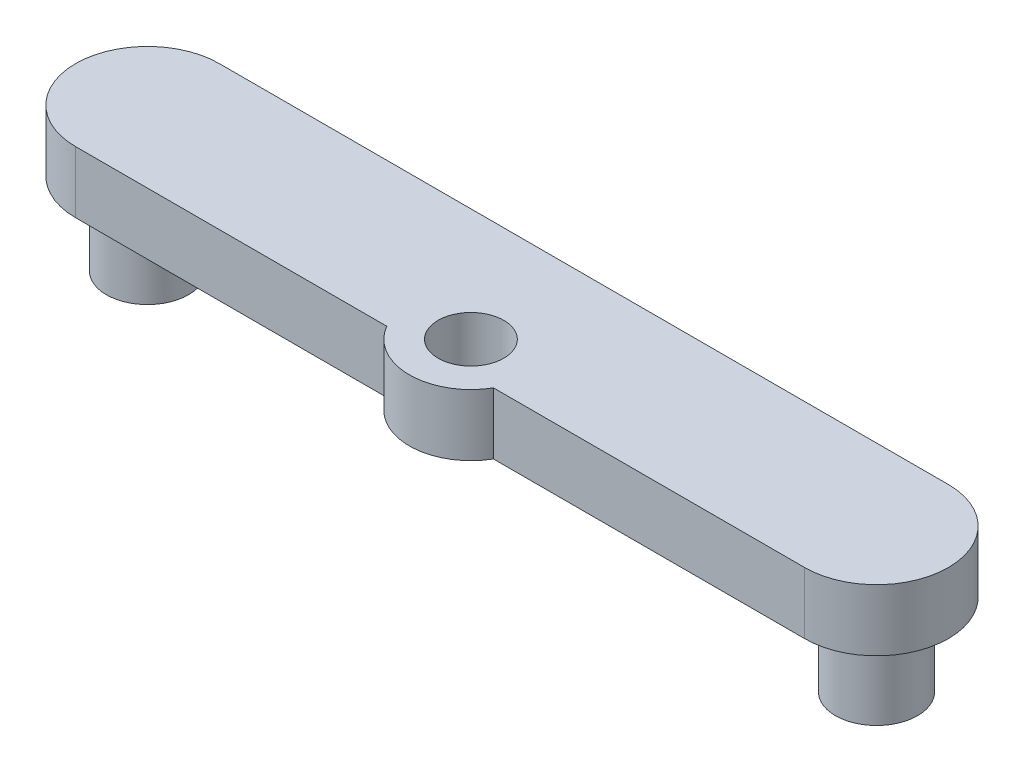
ISO-10303-21;
HEADER;
FILE_DESCRIPTION(('STEP AP214'),'2;1');
FILE_NAME('part.step','',(''),(''),'','','');
FILE_SCHEMA(('AUTOMOTIVE_DESIGN { 1 0 10303 214 1 1 1 1 }'));
ENDSEC;
DATA;
#1=APPLICATION_CONTEXT('core data for automotive mechanical design processes');
#2=APPLICATION_PROTOCOL_DEFINITION('international standard','automotive_design',2000,#1);
#3=PRODUCT_CONTEXT('',#1,'mechanical');
#4=PRODUCT('Part','Part','',(#3));
#5=PRODUCT_RELATED_PRODUCT_CATEGORY('part','',(#4));
#6=PRODUCT_DEFINITION_FORMATION('','',#4);
#7=PRODUCT_DEFINITION_CONTEXT('part definition',#1,'design');
#8=PRODUCT_DEFINITION('design','',#6,#7);
#9=PRODUCT_DEFINITION_SHAPE('','',#8);
#10=(LENGTH_UNIT() NAMED_UNIT(*) SI_UNIT(.MILLI.,.METRE.));
#11=(NAMED_UNIT(*) PLANE_ANGLE_UNIT() SI_UNIT($,.RADIAN.));
#12=(NAMED_UNIT(*) SI_UNIT($,.STERADIAN.) SOLID_ANGLE_UNIT());
#13=UNCERTAINTY_MEASURE_WITH_UNIT(LENGTH_MEASURE(1.E-05),#10,'distance_accuracy_value','');
#14=(GEOMETRIC_REPRESENTATION_CONTEXT(3) GLOBAL_UNCERTAINTY_ASSIGNED_CONTEXT((#13)) GLOBAL_UNIT_ASSIGNED_CONTEXT((#10,
#11,#12)) REPRESENTATION_CONTEXT('',''));
#15=CARTESIAN_POINT('',(0.,0.,0.));
#16=DIRECTION('',(0.,0.,1.));
#17=DIRECTION('',(1.,0.,0.));
#18=AXIS2_PLACEMENT_3D('',#15,#16,#17);
#19=CARTESIAN_POINT('',(0.,3.,3.5));
#20=DIRECTION('',(0.,0.,1.));
#21=DIRECTION('',(1.,0.,0.));
#22=AXIS2_PLACEMENT_3D('',#19,#20,#21);
#23=PLANE('',#22);
#24=DIRECTION('',(-1.,0.,0.));
#25=VECTOR('',#24,1.);
#26=CARTESIAN_POINT('',(0.,0.,3.5));
#27=LINE('',#26,#25);
#28=CARTESIAN_POINT('',(-2.59807621135332,0.,3.5));
#29=VERTEX_POINT('',#28);
#30=CARTESIAN_POINT('',(-17.75,0.,3.5));
#31=VERTEX_POINT('',#30);
#32=EDGE_CURVE('E124',#29,#31,#27,.T.);
#33=ORIENTED_EDGE('',*,*,#32,.F.);
#34=DIRECTION('',(0.,-1.,0.));
#35=VECTOR('',#34,1.);
#36=CARTESIAN_POINT('',(-2.59807621135332,3.,3.5));
#37=LINE('',#36,#35);
#38=CARTESIAN_POINT('',(-2.59807621135332,3.,3.5));
#39=VERTEX_POINT('',#38);
#40=EDGE_CURVE('E89',#39,#29,#37,.T.);
#41=ORIENTED_EDGE('',*,*,#40,.F.);
#42=DIRECTION('',(-1.,0.,0.));
#43=VECTOR('',#42,1.);
#44=CARTESIAN_POINT('',(0.,3.,3.5));
#45=LINE('',#44,#43);
#46=CARTESIAN_POINT('',(-17.75,3.,3.5));
#47=VERTEX_POINT('',#46);
#48=EDGE_CURVE('E139',#39,#47,#45,.T.);
#49=ORIENTED_EDGE('',*,*,#48,.T.);
#50=DIRECTION('',(0.,-1.,0.));
#51=VECTOR('',#50,1.);
#52=CARTESIAN_POINT('',(-17.75,3.,3.5));
#53=LINE('',#52,#51);
#54=EDGE_CURVE('E84',#47,#31,#53,.T.);
#55=ORIENTED_EDGE('',*,*,#54,.T.);
#56=EDGE_LOOP('',(#33,#41,#49,#55));
#57=FACE_BOUND('',#56,.T.);
#58=ADVANCED_FACE('F37',(#57),#23,.T.);
#59=CARTESIAN_POINT('',(0.,3.,2.));
#60=DIRECTION('',(0.,-1.,0.));
#61=DIRECTION('',(0.,0.,-1.));
#62=AXIS2_PLACEMENT_3D('',#59,#60,#61);
#63=CYLINDRICAL_SURFACE('',#62,3.);
#64=CARTESIAN_POINT('',(0.,0.,2.));
#65=DIRECTION('',(0.,1.,0.));
#66=DIRECTION('',(0.,0.,1.));
#67=AXIS2_PLACEMENT_3D('',#64,#65,#66);
#68=CIRCLE('',#67,3.);
#69=CARTESIAN_POINT('',(2.59807621135332,0.,3.5));
#70=VERTEX_POINT('',#69);
#71=EDGE_CURVE('E127',#29,#70,#68,.T.);
#72=ORIENTED_EDGE('',*,*,#71,.T.);
#73=DIRECTION('',(0.,-1.,0.));
#74=VECTOR('',#73,1.);
#75=CARTESIAN_POINT('',(2.59807621135332,3.,3.5));
#76=LINE('',#75,#74);
#77=CARTESIAN_POINT('',(2.59807621135332,3.,3.5));
#78=VERTEX_POINT('',#77);
#79=EDGE_CURVE('E143',#78,#70,#76,.T.);
#80=ORIENTED_EDGE('',*,*,#79,.F.);
#81=CARTESIAN_POINT('',(0.,3.,2.));
#82=DIRECTION('',(0.,1.,0.));
#83=DIRECTION('',(0.,0.,1.));
#84=AXIS2_PLACEMENT_3D('',#81,#82,#83);
#85=CIRCLE('',#84,3.);
#86=EDGE_CURVE('E187',#39,#78,#85,.T.);
#87=ORIENTED_EDGE('',*,*,#86,.F.);
#88=ORIENTED_EDGE('',*,*,#40,.T.);
#89=EDGE_LOOP('',(#72,#80,#87,#88));
#90=FACE_BOUND('',#89,.T.);
#91=ADVANCED_FACE('F39',(#90),#63,.T.);
#92=CARTESIAN_POINT('',(17.75,0.,3.49999999999999));
#93=VERTEX_POINT('',#92);
#94=EDGE_CURVE('E129',#93,#70,#27,.T.);
#95=ORIENTED_EDGE('',*,*,#94,.F.);
#96=DIRECTION('',(0.,-1.,0.));
#97=VECTOR('',#96,1.);
#98=CARTESIAN_POINT('',(17.75,3.,3.49999999999999));
#99=LINE('',#98,#97);
#100=CARTESIAN_POINT('',(17.75,3.,3.49999999999999));
#101=VERTEX_POINT('',#100);
#102=EDGE_CURVE('E113',#101,#93,#99,.T.);
#103=ORIENTED_EDGE('',*,*,#102,.F.);
#104=EDGE_CURVE('E106',#101,#78,#45,.T.);
#105=ORIENTED_EDGE('',*,*,#104,.T.);
#106=ORIENTED_EDGE('',*,*,#79,.T.);
#107=EDGE_LOOP('',(#95,#103,#105,#106));
#108=FACE_BOUND('',#107,.T.);
#109=ADVANCED_FACE('F173',(#108),#23,.T.);
#110=CARTESIAN_POINT('',(17.75,3.,0.));
#111=DIRECTION('',(0.,-1.,0.));
#112=DIRECTION('',(0.,0.,-1.));
#113=AXIS2_PLACEMENT_3D('',#110,#111,#112);
#114=CYLINDRICAL_SURFACE('',#113,3.5);
#115=CARTESIAN_POINT('',(17.75,0.,0.));
#116=DIRECTION('',(0.,1.,0.));
#117=DIRECTION('',(0.,0.,1.));
#118=AXIS2_PLACEMENT_3D('',#115,#116,#117);
#119=CIRCLE('',#118,3.5);
#120=CARTESIAN_POINT('',(17.75,0.,-3.5));
#121=VERTEX_POINT('',#120);
#122=EDGE_CURVE('E112',#93,#121,#119,.T.);
#123=ORIENTED_EDGE('',*,*,#122,.T.);
#124=DIRECTION('',(0.,-1.,0.));
#125=VECTOR('',#124,1.);
#126=CARTESIAN_POINT('',(17.75,3.,-3.5));
#127=LINE('',#126,#125);
#128=CARTESIAN_POINT('',(17.75,3.,-3.5));
#129=VERTEX_POINT('',#128);
#130=EDGE_CURVE('E109',#129,#121,#127,.T.);
#131=ORIENTED_EDGE('',*,*,#130,.F.);
#132=CARTESIAN_POINT('',(17.75,3.,0.));
#133=DIRECTION('',(0.,1.,0.));
#134=DIRECTION('',(0.,0.,1.));
#135=AXIS2_PLACEMENT_3D('',#132,#133,#134);
#136=CIRCLE('',#135,3.5);
#137=EDGE_CURVE('E99',#101,#129,#136,.T.);
#138=ORIENTED_EDGE('',*,*,#137,.F.);
#139=ORIENTED_EDGE('',*,*,#102,.T.);
#140=EDGE_LOOP('',(#123,#131,#138,#139));
#141=FACE_BOUND('',#140,.T.);
#142=ADVANCED_FACE('F110',(#141),#114,.T.);
#143=CARTESIAN_POINT('',(0.,3.,-3.5));
#144=DIRECTION('',(0.,0.,1.));
#145=DIRECTION('',(1.,0.,0.));
#146=AXIS2_PLACEMENT_3D('',#143,#144,#145);
#147=PLANE('',#146);
#148=DIRECTION('',(-1.,0.,0.));
#149=VECTOR('',#148,1.);
#150=CARTESIAN_POINT('',(0.,0.,-3.5));
#151=LINE('',#150,#149);
#152=CARTESIAN_POINT('',(-17.75,0.,-3.49999999999999));
#153=VERTEX_POINT('',#152);
#154=EDGE_CURVE('E77',#121,#153,#151,.T.);
#155=ORIENTED_EDGE('',*,*,#154,.T.);
#156=DIRECTION('',(0.,-1.,0.));
#157=VECTOR('',#156,1.);
#158=CARTESIAN_POINT('',(-17.75,3.,-3.49999999999999));
#159=LINE('',#158,#157);
#160=CARTESIAN_POINT('',(-17.75,3.,-3.49999999999999));
#161=VERTEX_POINT('',#160);
#162=EDGE_CURVE('E114',#161,#153,#159,.T.);
#163=ORIENTED_EDGE('',*,*,#162,.F.);
#164=DIRECTION('',(-1.,0.,0.));
#165=VECTOR('',#164,1.);
#166=CARTESIAN_POINT('',(0.,3.,-3.5));
#167=LINE('',#166,#165);
#168=EDGE_CURVE('E104',#129,#161,#167,.T.);
#169=ORIENTED_EDGE('',*,*,#168,.F.);
#170=ORIENTED_EDGE('',*,*,#130,.T.);
#171=EDGE_LOOP('',(#155,#163,#169,#170));
#172=FACE_BOUND('',#171,.T.);
#173=ADVANCED_FACE('F116',(#172),#147,.F.);
#174=CARTESIAN_POINT('',(-17.75,3.,0.));
#175=DIRECTION('',(0.,-1.,0.));
#176=DIRECTION('',(0.,0.,-1.));
#177=AXIS2_PLACEMENT_3D('',#174,#175,#176);
#178=CYLINDRICAL_SURFACE('',#177,3.5);
#179=CARTESIAN_POINT('',(-17.75,0.,0.));
#180=DIRECTION('',(0.,1.,0.));
#181=DIRECTION('',(0.,0.,1.));
#182=AXIS2_PLACEMENT_3D('',#179,#180,#181);
#183=CIRCLE('',#182,3.5);
#184=EDGE_CURVE('E134',#153,#31,#183,.T.);
#185=ORIENTED_EDGE('',*,*,#184,.T.);
#186=ORIENTED_EDGE('',*,*,#54,.F.);
#187=CARTESIAN_POINT('',(-17.75,3.,0.));
#188=DIRECTION('',(0.,1.,0.));
#189=DIRECTION('',(0.,0.,1.));
#190=AXIS2_PLACEMENT_3D('',#187,#188,#189);
#191=CIRCLE('',#190,3.5);
#192=EDGE_CURVE('E54',#161,#47,#191,.T.);
#193=ORIENTED_EDGE('',*,*,#192,.F.);
#194=ORIENTED_EDGE('',*,*,#162,.T.);
#195=EDGE_LOOP('',(#185,#186,#193,#194));
#196=FACE_BOUND('',#195,.T.);
#197=ADVANCED_FACE('F162',(#196),#178,.T.);
#198=CARTESIAN_POINT('',(0.,3.,2.));
#199=DIRECTION('',(0.,-1.,0.));
#200=DIRECTION('',(0.,0.,-1.));
#201=AXIS2_PLACEMENT_3D('',#198,#199,#200);
#202=CYLINDRICAL_SURFACE('',#201,1.6);
#203=CARTESIAN_POINT('',(0.,3.,2.));
#204=DIRECTION('',(0.,1.,0.));
#205=DIRECTION('',(0.,0.,1.));
#206=AXIS2_PLACEMENT_3D('',#203,#204,#205);
#207=CIRCLE('',#206,1.6);
#208=CARTESIAN_POINT('',(0.,3.,3.6));
#209=VERTEX_POINT('',#208);
#210=EDGE_CURVE('E118',#209,#209,#207,.T.);
#211=ORIENTED_EDGE('',*,*,#210,.T.);
#212=EDGE_LOOP('',(#211));
#213=FACE_BOUND('',#212,.T.);
#214=CARTESIAN_POINT('',(0.,0.,2.));
#215=DIRECTION('',(0.,1.,0.));
#216=DIRECTION('',(0.,0.,1.));
#217=AXIS2_PLACEMENT_3D('',#214,#215,#216);
#218=CIRCLE('',#217,1.6);
#219=CARTESIAN_POINT('',(0.,0.,3.6));
#220=VERTEX_POINT('',#219);
#221=EDGE_CURVE('E136',#220,#220,#218,.T.);
#222=ORIENTED_EDGE('',*,*,#221,.F.);
#223=EDGE_LOOP('',(#222));
#224=FACE_BOUND('',#223,.T.);
#225=ADVANCED_FACE('F160',(#213,#224),#202,.F.);
#226=CARTESIAN_POINT('',(0.,3.,0.));
#227=DIRECTION('',(0.,1.,0.));
#228=DIRECTION('',(0.,0.,1.));
#229=AXIS2_PLACEMENT_3D('',#226,#227,#228);
#230=PLANE('',#229);
#231=ORIENTED_EDGE('',*,*,#48,.F.);
#232=ORIENTED_EDGE('',*,*,#86,.T.);
#233=ORIENTED_EDGE('',*,*,#104,.F.);
#234=ORIENTED_EDGE('',*,*,#137,.T.);
#235=ORIENTED_EDGE('',*,*,#168,.T.);
#236=ORIENTED_EDGE('',*,*,#192,.T.);
#237=EDGE_LOOP('',(#231,#232,#233,#234,#235,#236));
#238=FACE_BOUND('',#237,.T.);
#239=ORIENTED_EDGE('',*,*,#210,.F.);
#240=EDGE_LOOP('',(#239));
#241=FACE_BOUND('',#240,.T.);
#242=ADVANCED_FACE('F101',(#238,#241),#230,.T.);
#243=CARTESIAN_POINT('',(0.,0.,0.));
#244=DIRECTION('',(0.,1.,0.));
#245=DIRECTION('',(0.,0.,1.));
#246=AXIS2_PLACEMENT_3D('',#243,#244,#245);
#247=PLANE('',#246);
#248=CARTESIAN_POINT('',(17.75,0.,0.));
#249=DIRECTION('',(0.,1.,0.));
#250=DIRECTION('',(0.,0.,1.));
#251=AXIS2_PLACEMENT_3D('',#248,#249,#250);
#252=CIRCLE('',#251,2.);
#253=CARTESIAN_POINT('',(17.75,0.,2.));
#254=VERTEX_POINT('',#253);
#255=EDGE_CURVE('E11',#254,#254,#252,.F.);
#256=ORIENTED_EDGE('',*,*,#255,.F.);
#257=EDGE_LOOP('',(#256));
#258=FACE_BOUND('',#257,.T.);
#259=CARTESIAN_POINT('',(-17.75,0.,0.));
#260=DIRECTION('',(0.,1.,0.));
#261=DIRECTION('',(0.,0.,1.));
#262=AXIS2_PLACEMENT_3D('',#259,#260,#261);
#263=CIRCLE('',#262,2.);
#264=CARTESIAN_POINT('',(-17.75,0.,2.));
#265=VERTEX_POINT('',#264);
#266=EDGE_CURVE('E46',#265,#265,#263,.F.);
#267=ORIENTED_EDGE('',*,*,#266,.F.);
#268=EDGE_LOOP('',(#267));
#269=FACE_BOUND('',#268,.T.);
#270=ORIENTED_EDGE('',*,*,#32,.T.);
#271=ORIENTED_EDGE('',*,*,#184,.F.);
#272=ORIENTED_EDGE('',*,*,#154,.F.);
#273=ORIENTED_EDGE('',*,*,#122,.F.);
#274=ORIENTED_EDGE('',*,*,#94,.T.);
#275=ORIENTED_EDGE('',*,*,#71,.F.);
#276=EDGE_LOOP('',(#270,#271,#272,#273,#274,#275));
#277=FACE_BOUND('',#276,.T.);
#278=ORIENTED_EDGE('',*,*,#221,.T.);
#279=EDGE_LOOP('',(#278));
#280=FACE_BOUND('',#279,.T.);
#281=ADVANCED_FACE('F150',(#258,#269,#277,#280),#247,.F.);
#282=CARTESIAN_POINT('',(-17.75,-4.,0.));
#283=DIRECTION('',(0.,1.,0.));
#284=DIRECTION('',(0.,0.,1.));
#285=AXIS2_PLACEMENT_3D('',#282,#283,#284);
#286=CYLINDRICAL_SURFACE('',#285,2.);
#287=CARTESIAN_POINT('',(-17.75,-4.,0.));
#288=DIRECTION('',(0.,-1.,0.));
#289=DIRECTION('',(0.,0.,-1.));
#290=AXIS2_PLACEMENT_3D('',#287,#288,#289);
#291=CIRCLE('',#290,2.);
#292=CARTESIAN_POINT('',(-17.75,-4.,-2.));
#293=VERTEX_POINT('',#292);
#294=EDGE_CURVE('E128',#293,#293,#291,.T.);
#295=ORIENTED_EDGE('',*,*,#294,.F.);
#296=EDGE_LOOP('',(#295));
#297=FACE_BOUND('',#296,.T.);
#298=ORIENTED_EDGE('',*,*,#266,.T.);
#299=EDGE_LOOP('',(#298));
#300=FACE_BOUND('',#299,.T.);
#301=ADVANCED_FACE('F148',(#297,#300),#286,.T.);
#302=CARTESIAN_POINT('',(-17.75,-4.,0.));
#303=DIRECTION('',(0.,-1.,0.));
#304=DIRECTION('',(0.,0.,-1.));
#305=AXIS2_PLACEMENT_3D('',#302,#303,#304);
#306=PLANE('',#305);
#307=ORIENTED_EDGE('',*,*,#294,.T.);
#308=EDGE_LOOP('',(#307));
#309=FACE_BOUND('',#308,.T.);
#310=ADVANCED_FACE('F201',(#309),#306,.T.);
#311=CARTESIAN_POINT('',(17.75,-4.,0.));
#312=DIRECTION('',(0.,1.,0.));
#313=DIRECTION('',(0.,0.,1.));
#314=AXIS2_PLACEMENT_3D('',#311,#312,#313);
#315=CYLINDRICAL_SURFACE('',#314,2.);
#316=CARTESIAN_POINT('',(17.75,-4.,0.));
#317=DIRECTION('',(0.,-1.,0.));
#318=DIRECTION('',(0.,0.,-1.));
#319=AXIS2_PLACEMENT_3D('',#316,#317,#318);
#320=CIRCLE('',#319,2.);
#321=CARTESIAN_POINT('',(17.75,-4.,-2.));
#322=VERTEX_POINT('',#321);
#323=EDGE_CURVE('E192',#322,#322,#320,.T.);
#324=ORIENTED_EDGE('',*,*,#323,.F.);
#325=EDGE_LOOP('',(#324));
#326=FACE_BOUND('',#325,.T.);
#327=ORIENTED_EDGE('',*,*,#255,.T.);
#328=EDGE_LOOP('',(#327));
#329=FACE_BOUND('',#328,.T.);
#330=ADVANCED_FACE('F198',(#326,#329),#315,.T.);
#331=CARTESIAN_POINT('',(17.75,-4.,0.));
#332=DIRECTION('',(0.,-1.,0.));
#333=DIRECTION('',(0.,0.,-1.));
#334=AXIS2_PLACEMENT_3D('',#331,#332,#333);
#335=PLANE('',#334);
#336=ORIENTED_EDGE('',*,*,#323,.T.);
#337=EDGE_LOOP('',(#336));
#338=FACE_BOUND('',#337,.T.);
#339=ADVANCED_FACE('F196',(#338),#335,.T.);
#340=CLOSED_SHELL('',(#58,#91,#109,#142,#173,#197,#225,#242,#281,#301,#310,#330,#339));
#341=MANIFOLD_SOLID_BREP('B2',#340);
#342=ADVANCED_BREP_SHAPE_REPRESENTATION('',(#18,#341),#14);
#343=SHAPE_DEFINITION_REPRESENTATION(#9,#342);
ENDSEC;
END-ISO-10303-21;
